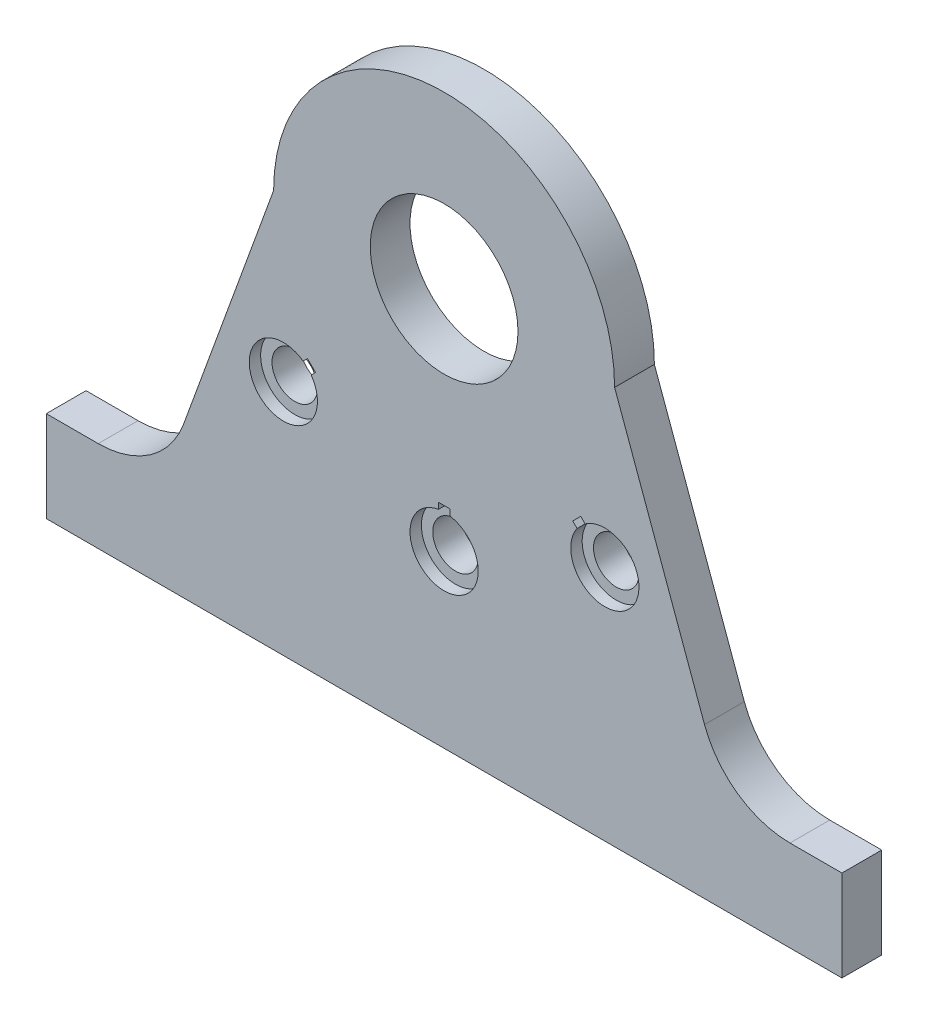
ISO-10303-21;
HEADER;
FILE_DESCRIPTION(('STEP AP214'),'2;1');
FILE_NAME('part.step','',(''),(''),'','','');
FILE_SCHEMA(('AUTOMOTIVE_DESIGN { 1 0 10303 214 1 1 1 1 }'));
ENDSEC;
DATA;
#1=APPLICATION_CONTEXT('core data for automotive mechanical design processes');
#2=APPLICATION_PROTOCOL_DEFINITION('international standard','automotive_design',2000,#1);
#3=PRODUCT_CONTEXT('',#1,'mechanical');
#4=PRODUCT('Part','Part','',(#3));
#5=PRODUCT_RELATED_PRODUCT_CATEGORY('part','',(#4));
#6=PRODUCT_DEFINITION_FORMATION('','',#4);
#7=PRODUCT_DEFINITION_CONTEXT('part definition',#1,'design');
#8=PRODUCT_DEFINITION('design','',#6,#7);
#9=PRODUCT_DEFINITION_SHAPE('','',#8);
#10=(LENGTH_UNIT() NAMED_UNIT(*) SI_UNIT(.MILLI.,.METRE.));
#11=(NAMED_UNIT(*) PLANE_ANGLE_UNIT() SI_UNIT($,.RADIAN.));
#12=(NAMED_UNIT(*) SI_UNIT($,.STERADIAN.) SOLID_ANGLE_UNIT());
#13=UNCERTAINTY_MEASURE_WITH_UNIT(LENGTH_MEASURE(1.E-05),#10,'distance_accuracy_value','');
#14=(GEOMETRIC_REPRESENTATION_CONTEXT(3) GLOBAL_UNCERTAINTY_ASSIGNED_CONTEXT((#13)) GLOBAL_UNIT_ASSIGNED_CONTEXT((#10,
#11,#12)) REPRESENTATION_CONTEXT('',''));
#15=CARTESIAN_POINT('',(0.,0.,0.));
#16=DIRECTION('',(0.,0.,1.));
#17=DIRECTION('',(1.,0.,0.));
#18=AXIS2_PLACEMENT_3D('',#15,#16,#17);
#19=CARTESIAN_POINT('',(14.142135623731,-14.142135623731,-6.5));
#20=DIRECTION('',(0.,0.,1.));
#21=DIRECTION('',(1.,0.,0.));
#22=AXIS2_PLACEMENT_3D('',#19,#20,#21);
#23=CYLINDRICAL_SURFACE('',#22,2.);
#24=CARTESIAN_POINT('',(14.142135623731,-14.142135623731,0.));
#25=DIRECTION('',(0.,0.,1.));
#26=DIRECTION('',(1.,0.,0.));
#27=AXIS2_PLACEMENT_3D('',#24,#25,#26);
#28=CIRCLE('',#27,2.);
#29=CARTESIAN_POINT('',(16.142135623731,-14.142135623731,0.));
#30=VERTEX_POINT('',#29);
#31=EDGE_CURVE('E440',#30,#30,#28,.T.);
#32=ORIENTED_EDGE('',*,*,#31,.F.);
#33=EDGE_LOOP('',(#32));
#34=FACE_BOUND('',#33,.T.);
#35=CARTESIAN_POINT('',(14.142135623731,-14.142135623731,2.5));
#36=DIRECTION('',(0.,0.,1.));
#37=DIRECTION('',(1.,0.,0.));
#38=AXIS2_PLACEMENT_3D('',#35,#36,#37);
#39=CIRCLE('',#38,2.);
#40=CARTESIAN_POINT('',(16.142135623731,-14.142135623731,2.5));
#41=VERTEX_POINT('',#40);
#42=EDGE_CURVE('E48',#41,#41,#39,.F.);
#43=ORIENTED_EDGE('',*,*,#42,.F.);
#44=EDGE_LOOP('',(#43));
#45=FACE_BOUND('',#44,.T.);
#46=ADVANCED_FACE('F44',(#34,#45),#23,.F.);
#47=CARTESIAN_POINT('',(0.,-20.,-6.5));
#48=DIRECTION('',(0.,0.,1.));
#49=DIRECTION('',(1.,0.,0.));
#50=AXIS2_PLACEMENT_3D('',#47,#48,#49);
#51=CYLINDRICAL_SURFACE('',#50,2.);
#52=CARTESIAN_POINT('',(0.,-20.,0.));
#53=DIRECTION('',(0.,0.,1.));
#54=DIRECTION('',(1.,0.,0.));
#55=AXIS2_PLACEMENT_3D('',#52,#53,#54);
#56=CIRCLE('',#55,2.);
#57=CARTESIAN_POINT('',(2.,-20.,0.));
#58=VERTEX_POINT('',#57);
#59=EDGE_CURVE('E444',#58,#58,#56,.T.);
#60=ORIENTED_EDGE('',*,*,#59,.F.);
#61=EDGE_LOOP('',(#60));
#62=FACE_BOUND('',#61,.T.);
#63=CARTESIAN_POINT('',(0.,-20.,2.5));
#64=DIRECTION('',(0.,0.,1.));
#65=DIRECTION('',(1.,0.,0.));
#66=AXIS2_PLACEMENT_3D('',#63,#64,#65);
#67=CIRCLE('',#66,2.);
#68=CARTESIAN_POINT('',(2.,-20.,2.5));
#69=VERTEX_POINT('',#68);
#70=EDGE_CURVE('E453',#69,#69,#67,.F.);
#71=ORIENTED_EDGE('',*,*,#70,.F.);
#72=EDGE_LOOP('',(#71));
#73=FACE_BOUND('',#72,.T.);
#74=ADVANCED_FACE('F463',(#62,#73),#51,.F.);
#75=CARTESIAN_POINT('',(-14.1421356237309,-14.142135623731,-6.5));
#76=DIRECTION('',(0.,0.,1.));
#77=DIRECTION('',(1.,0.,0.));
#78=AXIS2_PLACEMENT_3D('',#75,#76,#77);
#79=CYLINDRICAL_SURFACE('',#78,2.);
#80=CARTESIAN_POINT('',(-14.1421356237309,-14.142135623731,0.));
#81=DIRECTION('',(0.,0.,1.));
#82=DIRECTION('',(1.,0.,0.));
#83=AXIS2_PLACEMENT_3D('',#80,#81,#82);
#84=CIRCLE('',#83,2.);
#85=CARTESIAN_POINT('',(-12.1421356237309,-14.142135623731,0.));
#86=VERTEX_POINT('',#85);
#87=EDGE_CURVE('E343',#86,#86,#84,.T.);
#88=ORIENTED_EDGE('',*,*,#87,.F.);
#89=EDGE_LOOP('',(#88));
#90=FACE_BOUND('',#89,.T.);
#91=CARTESIAN_POINT('',(-14.1421356237309,-14.142135623731,2.5));
#92=DIRECTION('',(0.,0.,1.));
#93=DIRECTION('',(1.,0.,0.));
#94=AXIS2_PLACEMENT_3D('',#91,#92,#93);
#95=CIRCLE('',#94,2.);
#96=CARTESIAN_POINT('',(-12.1421356237309,-14.142135623731,2.5));
#97=VERTEX_POINT('',#96);
#98=EDGE_CURVE('E243',#97,#97,#95,.F.);
#99=ORIENTED_EDGE('',*,*,#98,.F.);
#100=EDGE_LOOP('',(#99));
#101=FACE_BOUND('',#100,.T.);
#102=ADVANCED_FACE('F470',(#90,#101),#79,.F.);
#103=CARTESIAN_POINT('',(0.,0.,3.5));
#104=DIRECTION('',(0.,0.,1.));
#105=DIRECTION('',(1.,0.,0.));
#106=AXIS2_PLACEMENT_3D('',#103,#104,#105);
#107=PLANE('',#106);
#108=DIRECTION('',(-0.707106781186547,-0.707106781186548,0.));
#109=VECTOR('',#108,1.);
#110=CARTESIAN_POINT('',(11.6672618895781,-11.667261889578,3.5));
#111=LINE('',#110,#109);
#112=CARTESIAN_POINT('',(12.0208152801713,-11.3137084989848,3.5));
#113=VERTEX_POINT('',#112);
#114=CARTESIAN_POINT('',(11.3137084989848,-12.0208152801713,3.5));
#115=VERTEX_POINT('',#114);
#116=EDGE_CURVE('E62',#113,#115,#111,.T.);
#117=ORIENTED_EDGE('',*,*,#116,.F.);
#118=DIRECTION('',(-0.707106781186538,0.707106781186557,0.));
#119=VECTOR('',#118,1.);
#120=CARTESIAN_POINT('',(0.353553390593446,0.353553390593436,3.5));
#121=LINE('',#120,#119);
#122=CARTESIAN_POINT('',(12.404038947989,-11.6969321668025,3.5));
#123=VERTEX_POINT('',#122);
#124=EDGE_CURVE('E220',#123,#113,#121,.T.);
#125=ORIENTED_EDGE('',*,*,#124,.F.);
#126=CARTESIAN_POINT('',(14.142135623731,-14.142135623731,3.5));
#127=DIRECTION('',(0.,0.,1.));
#128=DIRECTION('',(1.,0.,0.));
#129=AXIS2_PLACEMENT_3D('',#126,#127,#128);
#130=CIRCLE('',#129,3.);
#131=CARTESIAN_POINT('',(11.6969321668025,-12.404038947989,3.5));
#132=VERTEX_POINT('',#131);
#133=EDGE_CURVE('E224',#132,#123,#130,.T.);
#134=ORIENTED_EDGE('',*,*,#133,.F.);
#135=DIRECTION('',(0.707106781186541,-0.707106781186554,0.));
#136=VECTOR('',#135,1.);
#137=CARTESIAN_POINT('',(-0.353553390593173,-0.353553390593167,3.5));
#138=LINE('',#137,#136);
#139=EDGE_CURVE('E233',#115,#132,#138,.T.);
#140=ORIENTED_EDGE('',*,*,#139,.F.);
#141=EDGE_LOOP('',(#117,#125,#134,#140));
#142=FACE_BOUND('',#141,.T.);
#143=DIRECTION('',(-1.,0.,0.));
#144=VECTOR('',#143,1.);
#145=CARTESIAN_POINT('',(0.,-16.5,3.5));
#146=LINE('',#145,#144);
#147=CARTESIAN_POINT('',(0.5,-16.5,3.5));
#148=VERTEX_POINT('',#147);
#149=CARTESIAN_POINT('',(-0.5,-16.5,3.5));
#150=VERTEX_POINT('',#149);
#151=EDGE_CURVE('E70',#148,#150,#146,.T.);
#152=ORIENTED_EDGE('',*,*,#151,.F.);
#153=DIRECTION('',(0.,1.,0.));
#154=VECTOR('',#153,1.);
#155=CARTESIAN_POINT('',(0.500000000000003,0.,3.5));
#156=LINE('',#155,#154);
#157=CARTESIAN_POINT('',(0.5,-17.0419601084502,3.5));
#158=VERTEX_POINT('',#157);
#159=EDGE_CURVE('E254',#158,#148,#156,.T.);
#160=ORIENTED_EDGE('',*,*,#159,.F.);
#161=CARTESIAN_POINT('',(0.,-20.,3.5));
#162=DIRECTION('',(0.,0.,1.));
#163=DIRECTION('',(1.,0.,0.));
#164=AXIS2_PLACEMENT_3D('',#161,#162,#163);
#165=CIRCLE('',#164,3.);
#166=CARTESIAN_POINT('',(-0.5,-17.0419601084502,3.5));
#167=VERTEX_POINT('',#166);
#168=EDGE_CURVE('E274',#167,#158,#165,.T.);
#169=ORIENTED_EDGE('',*,*,#168,.F.);
#170=DIRECTION('',(0.,-1.,0.));
#171=VECTOR('',#170,1.);
#172=CARTESIAN_POINT('',(-0.5,0.,3.5));
#173=LINE('',#172,#171);
#174=EDGE_CURVE('E269',#150,#167,#173,.T.);
#175=ORIENTED_EDGE('',*,*,#174,.F.);
#176=EDGE_LOOP('',(#152,#160,#169,#175));
#177=FACE_BOUND('',#176,.T.);
#178=DIRECTION('',(-0.707106781186548,0.707106781186547,0.));
#179=VECTOR('',#178,1.);
#180=CARTESIAN_POINT('',(-11.667261889578,-11.6672618895781,3.5));
#181=LINE('',#180,#179);
#182=CARTESIAN_POINT('',(-11.3137084989848,-12.0208152801713,3.5));
#183=VERTEX_POINT('',#182);
#184=CARTESIAN_POINT('',(-12.0208152801713,-11.3137084989848,3.5));
#185=VERTEX_POINT('',#184);
#186=EDGE_CURVE('E309',#183,#185,#181,.T.);
#187=ORIENTED_EDGE('',*,*,#186,.F.);
#188=DIRECTION('',(0.707106781186551,0.707106781186544,0.));
#189=VECTOR('',#188,1.);
#190=CARTESIAN_POINT('',(0.353553390593328,-0.353553390593331,3.5));
#191=LINE('',#190,#189);
#192=CARTESIAN_POINT('',(-11.6969321668025,-12.404038947989,3.5));
#193=VERTEX_POINT('',#192);
#194=EDGE_CURVE('E296',#193,#183,#191,.T.);
#195=ORIENTED_EDGE('',*,*,#194,.F.);
#196=CARTESIAN_POINT('',(-14.142135623731,-14.142135623731,3.5));
#197=DIRECTION('',(0.,0.,1.));
#198=DIRECTION('',(1.,0.,0.));
#199=AXIS2_PLACEMENT_3D('',#196,#197,#198);
#200=CIRCLE('',#199,3.00000000000001);
#201=CARTESIAN_POINT('',(-12.404038947989,-11.6969321668025,3.5));
#202=VERTEX_POINT('',#201);
#203=EDGE_CURVE('E316',#202,#193,#200,.T.);
#204=ORIENTED_EDGE('',*,*,#203,.F.);
#205=DIRECTION('',(-0.70710678118656,-0.707106781186535,0.));
#206=VECTOR('',#205,1.);
#207=CARTESIAN_POINT('',(-0.353553390593052,0.353553390593065,3.5));
#208=LINE('',#207,#206);
#209=EDGE_CURVE('E312',#185,#202,#208,.T.);
#210=ORIENTED_EDGE('',*,*,#209,.F.);
#211=EDGE_LOOP('',(#187,#195,#204,#210));
#212=FACE_BOUND('',#211,.T.);
#213=CARTESIAN_POINT('',(0.,0.,3.5));
#214=DIRECTION('',(0.,0.,1.));
#215=DIRECTION('',(1.,0.,0.));
#216=AXIS2_PLACEMENT_3D('',#213,#214,#215);
#217=CIRCLE('',#216,15.);
#218=CARTESIAN_POINT('',(15.,0.,3.5));
#219=VERTEX_POINT('',#218);
#220=CARTESIAN_POINT('',(-15.,0.,3.5));
#221=VERTEX_POINT('',#220);
#222=EDGE_CURVE('E344',#219,#221,#217,.T.);
#223=ORIENTED_EDGE('',*,*,#222,.T.);
#224=DIRECTION('',(-0.342020143325669,-0.939692620785908,0.));
#225=VECTOR('',#224,1.);
#226=CARTESIAN_POINT('',(-15.,0.,3.5));
#227=LINE('',#226,#225);
#228=CARTESIAN_POINT('',(-22.9113156645779,-21.7361611466054,3.5));
#229=VERTEX_POINT('',#228);
#230=EDGE_CURVE('E348',#221,#229,#227,.T.);
#231=ORIENTED_EDGE('',*,*,#230,.T.);
#232=CARTESIAN_POINT('',(-30.4288566308652,-19.,3.5));
#233=DIRECTION('',(0.,0.,-1.));
#234=DIRECTION('',(1.,0.,0.));
#235=AXIS2_PLACEMENT_3D('',#232,#233,#234);
#236=CIRCLE('',#235,8.);
#237=CARTESIAN_POINT('',(-30.4288566308652,-27.,3.5));
#238=VERTEX_POINT('',#237);
#239=EDGE_CURVE('E352',#229,#238,#236,.T.);
#240=ORIENTED_EDGE('',*,*,#239,.T.);
#241=DIRECTION('',(-1.,0.,0.));
#242=VECTOR('',#241,1.);
#243=CARTESIAN_POINT('',(-30.4288566308652,-27.,3.5));
#244=LINE('',#243,#242);
#245=CARTESIAN_POINT('',(-35.,-27.,3.5));
#246=VERTEX_POINT('',#245);
#247=EDGE_CURVE('E355',#238,#246,#244,.T.);
#248=ORIENTED_EDGE('',*,*,#247,.T.);
#249=DIRECTION('',(0.,-1.,0.));
#250=VECTOR('',#249,1.);
#251=CARTESIAN_POINT('',(-35.,-27.,3.5));
#252=LINE('',#251,#250);
#253=CARTESIAN_POINT('',(-35.,-35.,3.5));
#254=VERTEX_POINT('',#253);
#255=EDGE_CURVE('E358',#246,#254,#252,.T.);
#256=ORIENTED_EDGE('',*,*,#255,.T.);
#257=DIRECTION('',(1.,0.,0.));
#258=VECTOR('',#257,1.);
#259=CARTESIAN_POINT('',(-35.,-35.,3.5));
#260=LINE('',#259,#258);
#261=CARTESIAN_POINT('',(35.,-35.,3.5));
#262=VERTEX_POINT('',#261);
#263=EDGE_CURVE('E361',#254,#262,#260,.T.);
#264=ORIENTED_EDGE('',*,*,#263,.T.);
#265=DIRECTION('',(0.,1.,0.));
#266=VECTOR('',#265,1.);
#267=CARTESIAN_POINT('',(35.,-35.,3.5));
#268=LINE('',#267,#266);
#269=CARTESIAN_POINT('',(35.,-27.,3.5));
#270=VERTEX_POINT('',#269);
#271=EDGE_CURVE('E364',#262,#270,#268,.T.);
#272=ORIENTED_EDGE('',*,*,#271,.T.);
#273=DIRECTION('',(-1.,0.,0.));
#274=VECTOR('',#273,1.);
#275=CARTESIAN_POINT('',(35.,-27.,3.5));
#276=LINE('',#275,#274);
#277=CARTESIAN_POINT('',(30.4288566308652,-27.,3.5));
#278=VERTEX_POINT('',#277);
#279=EDGE_CURVE('E367',#270,#278,#276,.T.);
#280=ORIENTED_EDGE('',*,*,#279,.T.);
#281=CARTESIAN_POINT('',(30.4288566308652,-19.,3.5));
#282=DIRECTION('',(0.,0.,-1.));
#283=DIRECTION('',(-1.,0.,0.));
#284=AXIS2_PLACEMENT_3D('',#281,#282,#283);
#285=CIRCLE('',#284,8.);
#286=CARTESIAN_POINT('',(22.9113156645779,-21.7361611466054,3.5));
#287=VERTEX_POINT('',#286);
#288=EDGE_CURVE('E370',#278,#287,#285,.T.);
#289=ORIENTED_EDGE('',*,*,#288,.T.);
#290=DIRECTION('',(-0.342020143325669,0.939692620785908,0.));
#291=VECTOR('',#290,1.);
#292=CARTESIAN_POINT('',(22.9113156645779,-21.7361611466054,3.5));
#293=LINE('',#292,#291);
#294=EDGE_CURVE('E373',#287,#219,#293,.T.);
#295=ORIENTED_EDGE('',*,*,#294,.T.);
#296=EDGE_LOOP('',(#223,#231,#240,#248,#256,#264,#272,#280,#289,#295));
#297=FACE_BOUND('',#296,.T.);
#298=CARTESIAN_POINT('',(0.,0.,3.5));
#299=DIRECTION('',(0.,0.,1.));
#300=DIRECTION('',(1.,0.,0.));
#301=AXIS2_PLACEMENT_3D('',#298,#299,#300);
#302=CIRCLE('',#301,6.5);
#303=CARTESIAN_POINT('',(6.5,0.,3.5));
#304=VERTEX_POINT('',#303);
#305=EDGE_CURVE('E334',#304,#304,#302,.T.);
#306=ORIENTED_EDGE('',*,*,#305,.F.);
#307=EDGE_LOOP('',(#306));
#308=FACE_BOUND('',#307,.T.);
#309=ADVANCED_FACE('F482',(#142,#177,#212,#297,#308),#107,.T.);
#310=CARTESIAN_POINT('',(0.,0.,0.));
#311=DIRECTION('',(0.,0.,1.));
#312=DIRECTION('',(1.,0.,0.));
#313=AXIS2_PLACEMENT_3D('',#310,#311,#312);
#314=PLANE('',#313);
#315=ORIENTED_EDGE('',*,*,#87,.T.);
#316=EDGE_LOOP('',(#315));
#317=FACE_BOUND('',#316,.T.);
#318=ORIENTED_EDGE('',*,*,#59,.T.);
#319=EDGE_LOOP('',(#318));
#320=FACE_BOUND('',#319,.T.);
#321=ORIENTED_EDGE('',*,*,#31,.T.);
#322=EDGE_LOOP('',(#321));
#323=FACE_BOUND('',#322,.T.);
#324=CARTESIAN_POINT('',(0.,0.,0.));
#325=DIRECTION('',(0.,0.,1.));
#326=DIRECTION('',(1.,0.,0.));
#327=AXIS2_PLACEMENT_3D('',#324,#325,#326);
#328=CIRCLE('',#327,15.);
#329=CARTESIAN_POINT('',(15.,0.,0.));
#330=VERTEX_POINT('',#329);
#331=CARTESIAN_POINT('',(-15.,0.,0.));
#332=VERTEX_POINT('',#331);
#333=EDGE_CURVE('E338',#330,#332,#328,.T.);
#334=ORIENTED_EDGE('',*,*,#333,.F.);
#335=DIRECTION('',(-0.342020143325669,0.939692620785908,0.));
#336=VECTOR('',#335,1.);
#337=CARTESIAN_POINT('',(22.9113156645779,-21.7361611466054,0.));
#338=LINE('',#337,#336);
#339=CARTESIAN_POINT('',(22.9113156645779,-21.7361611466054,0.));
#340=VERTEX_POINT('',#339);
#341=EDGE_CURVE('E349',#340,#330,#338,.T.);
#342=ORIENTED_EDGE('',*,*,#341,.F.);
#343=CARTESIAN_POINT('',(30.4288566308652,-19.,0.));
#344=DIRECTION('',(0.,0.,-1.));
#345=DIRECTION('',(-1.,0.,0.));
#346=AXIS2_PLACEMENT_3D('',#343,#344,#345);
#347=CIRCLE('',#346,8.);
#348=CARTESIAN_POINT('',(30.4288566308652,-27.,0.));
#349=VERTEX_POINT('',#348);
#350=EDGE_CURVE('E401',#349,#340,#347,.T.);
#351=ORIENTED_EDGE('',*,*,#350,.F.);
#352=DIRECTION('',(-1.,0.,0.));
#353=VECTOR('',#352,1.);
#354=CARTESIAN_POINT('',(35.,-27.,0.));
#355=LINE('',#354,#353);
#356=CARTESIAN_POINT('',(35.,-27.,0.));
#357=VERTEX_POINT('',#356);
#358=EDGE_CURVE('E398',#357,#349,#355,.T.);
#359=ORIENTED_EDGE('',*,*,#358,.F.);
#360=DIRECTION('',(0.,1.,0.));
#361=VECTOR('',#360,1.);
#362=CARTESIAN_POINT('',(35.,-35.,0.));
#363=LINE('',#362,#361);
#364=CARTESIAN_POINT('',(35.,-35.,0.));
#365=VERTEX_POINT('',#364);
#366=EDGE_CURVE('E395',#365,#357,#363,.T.);
#367=ORIENTED_EDGE('',*,*,#366,.F.);
#368=DIRECTION('',(1.,0.,0.));
#369=VECTOR('',#368,1.);
#370=CARTESIAN_POINT('',(-35.,-35.,0.));
#371=LINE('',#370,#369);
#372=CARTESIAN_POINT('',(-35.,-35.,0.));
#373=VERTEX_POINT('',#372);
#374=EDGE_CURVE('E392',#373,#365,#371,.T.);
#375=ORIENTED_EDGE('',*,*,#374,.F.);
#376=DIRECTION('',(0.,-1.,0.));
#377=VECTOR('',#376,1.);
#378=CARTESIAN_POINT('',(-35.,-27.,0.));
#379=LINE('',#378,#377);
#380=CARTESIAN_POINT('',(-35.,-27.,0.));
#381=VERTEX_POINT('',#380);
#382=EDGE_CURVE('E389',#381,#373,#379,.T.);
#383=ORIENTED_EDGE('',*,*,#382,.F.);
#384=DIRECTION('',(-1.,0.,0.));
#385=VECTOR('',#384,1.);
#386=CARTESIAN_POINT('',(-30.4288566308652,-27.,0.));
#387=LINE('',#386,#385);
#388=CARTESIAN_POINT('',(-30.4288566308652,-27.,0.));
#389=VERTEX_POINT('',#388);
#390=EDGE_CURVE('E386',#389,#381,#387,.T.);
#391=ORIENTED_EDGE('',*,*,#390,.F.);
#392=CARTESIAN_POINT('',(-30.4288566308652,-19.,0.));
#393=DIRECTION('',(0.,0.,-1.));
#394=DIRECTION('',(1.,0.,0.));
#395=AXIS2_PLACEMENT_3D('',#392,#393,#394);
#396=CIRCLE('',#395,8.);
#397=CARTESIAN_POINT('',(-22.9113156645779,-21.7361611466054,0.));
#398=VERTEX_POINT('',#397);
#399=EDGE_CURVE('E383',#398,#389,#396,.T.);
#400=ORIENTED_EDGE('',*,*,#399,.F.);
#401=DIRECTION('',(-0.342020143325669,-0.939692620785908,0.));
#402=VECTOR('',#401,1.);
#403=CARTESIAN_POINT('',(-15.,0.,0.));
#404=LINE('',#403,#402);
#405=EDGE_CURVE('E380',#332,#398,#404,.T.);
#406=ORIENTED_EDGE('',*,*,#405,.F.);
#407=EDGE_LOOP('',(#334,#342,#351,#359,#367,#375,#383,#391,#400,#406));
#408=FACE_BOUND('',#407,.T.);
#409=CARTESIAN_POINT('',(0.,0.,0.));
#410=DIRECTION('',(0.,0.,1.));
#411=DIRECTION('',(1.,0.,0.));
#412=AXIS2_PLACEMENT_3D('',#409,#410,#411);
#413=CIRCLE('',#412,6.5);
#414=CARTESIAN_POINT('',(6.5,0.,0.));
#415=VERTEX_POINT('',#414);
#416=EDGE_CURVE('E339',#415,#415,#413,.T.);
#417=ORIENTED_EDGE('',*,*,#416,.T.);
#418=EDGE_LOOP('',(#417));
#419=FACE_BOUND('',#418,.T.);
#420=ADVANCED_FACE('F485',(#317,#320,#323,#408,#419),#314,.F.);
#421=CARTESIAN_POINT('',(0.,0.,3.5));
#422=DIRECTION('',(0.,0.,-1.));
#423=DIRECTION('',(-1.,0.,0.));
#424=AXIS2_PLACEMENT_3D('',#421,#422,#423);
#425=CYLINDRICAL_SURFACE('',#424,15.);
#426=ORIENTED_EDGE('',*,*,#333,.T.);
#427=DIRECTION('',(0.,0.,-1.));
#428=VECTOR('',#427,1.);
#429=CARTESIAN_POINT('',(-15.,0.,3.5));
#430=LINE('',#429,#428);
#431=EDGE_CURVE('E11',#221,#332,#430,.T.);
#432=ORIENTED_EDGE('',*,*,#431,.F.);
#433=ORIENTED_EDGE('',*,*,#222,.F.);
#434=DIRECTION('',(0.,0.,-1.));
#435=VECTOR('',#434,1.);
#436=CARTESIAN_POINT('',(15.,0.,3.5));
#437=LINE('',#436,#435);
#438=EDGE_CURVE('E376',#219,#330,#437,.T.);
#439=ORIENTED_EDGE('',*,*,#438,.T.);
#440=EDGE_LOOP('',(#426,#432,#433,#439));
#441=FACE_BOUND('',#440,.T.);
#442=ADVANCED_FACE('F46',(#441),#425,.T.);
#443=CARTESIAN_POINT('',(-15.,0.,3.5));
#444=DIRECTION('',(0.939692620785908,-0.342020143325669,0.));
#445=DIRECTION('',(0.342020143325669,0.939692620785908,0.));
#446=AXIS2_PLACEMENT_3D('',#443,#444,#445);
#447=PLANE('',#446);
#448=ORIENTED_EDGE('',*,*,#405,.T.);
#449=DIRECTION('',(0.,0.,-1.));
#450=VECTOR('',#449,1.);
#451=CARTESIAN_POINT('',(-22.9113156645779,-21.7361611466054,3.5));
#452=LINE('',#451,#450);
#453=EDGE_CURVE('E54',#229,#398,#452,.T.);
#454=ORIENTED_EDGE('',*,*,#453,.F.);
#455=ORIENTED_EDGE('',*,*,#230,.F.);
#456=ORIENTED_EDGE('',*,*,#431,.T.);
#457=EDGE_LOOP('',(#448,#454,#455,#456));
#458=FACE_BOUND('',#457,.T.);
#459=ADVANCED_FACE('F518',(#458),#447,.F.);
#460=CARTESIAN_POINT('',(-30.4288566308652,-19.,3.5));
#461=DIRECTION('',(0.,0.,-1.));
#462=DIRECTION('',(-1.,0.,0.));
#463=AXIS2_PLACEMENT_3D('',#460,#461,#462);
#464=CYLINDRICAL_SURFACE('',#463,8.);
#465=ORIENTED_EDGE('',*,*,#399,.T.);
#466=DIRECTION('',(0.,0.,-1.));
#467=VECTOR('',#466,1.);
#468=CARTESIAN_POINT('',(-30.4288566308652,-27.,3.5));
#469=LINE('',#468,#467);
#470=EDGE_CURVE('E433',#238,#389,#469,.T.);
#471=ORIENTED_EDGE('',*,*,#470,.F.);
#472=ORIENTED_EDGE('',*,*,#239,.F.);
#473=ORIENTED_EDGE('',*,*,#453,.T.);
#474=EDGE_LOOP('',(#465,#471,#472,#473));
#475=FACE_BOUND('',#474,.T.);
#476=ADVANCED_FACE('F515',(#475),#464,.F.);
#477=CARTESIAN_POINT('',(-30.4288566308652,-27.,3.5));
#478=DIRECTION('',(0.,-1.,0.));
#479=DIRECTION('',(0.,0.,-1.));
#480=AXIS2_PLACEMENT_3D('',#477,#478,#479);
#481=PLANE('',#480);
#482=ORIENTED_EDGE('',*,*,#390,.T.);
#483=DIRECTION('',(0.,0.,-1.));
#484=VECTOR('',#483,1.);
#485=CARTESIAN_POINT('',(-35.,-27.,3.5));
#486=LINE('',#485,#484);
#487=EDGE_CURVE('E429',#246,#381,#486,.T.);
#488=ORIENTED_EDGE('',*,*,#487,.F.);
#489=ORIENTED_EDGE('',*,*,#247,.F.);
#490=ORIENTED_EDGE('',*,*,#470,.T.);
#491=EDGE_LOOP('',(#482,#488,#489,#490));
#492=FACE_BOUND('',#491,.T.);
#493=ADVANCED_FACE('F511',(#492),#481,.F.);
#494=CARTESIAN_POINT('',(-35.,-27.,3.5));
#495=DIRECTION('',(1.,0.,0.));
#496=DIRECTION('',(0.,1.,0.));
#497=AXIS2_PLACEMENT_3D('',#494,#495,#496);
#498=PLANE('',#497);
#499=ORIENTED_EDGE('',*,*,#382,.T.);
#500=DIRECTION('',(0.,0.,-1.));
#501=VECTOR('',#500,1.);
#502=CARTESIAN_POINT('',(-35.,-35.,3.5));
#503=LINE('',#502,#501);
#504=EDGE_CURVE('E425',#254,#373,#503,.T.);
#505=ORIENTED_EDGE('',*,*,#504,.F.);
#506=ORIENTED_EDGE('',*,*,#255,.F.);
#507=ORIENTED_EDGE('',*,*,#487,.T.);
#508=EDGE_LOOP('',(#499,#505,#506,#507));
#509=FACE_BOUND('',#508,.T.);
#510=ADVANCED_FACE('F507',(#509),#498,.F.);
#511=CARTESIAN_POINT('',(-35.,-35.,3.5));
#512=DIRECTION('',(0.,1.,0.));
#513=DIRECTION('',(0.,0.,1.));
#514=AXIS2_PLACEMENT_3D('',#511,#512,#513);
#515=PLANE('',#514);
#516=ORIENTED_EDGE('',*,*,#374,.T.);
#517=DIRECTION('',(0.,0.,-1.));
#518=VECTOR('',#517,1.);
#519=CARTESIAN_POINT('',(35.,-35.,3.5));
#520=LINE('',#519,#518);
#521=EDGE_CURVE('E421',#262,#365,#520,.T.);
#522=ORIENTED_EDGE('',*,*,#521,.F.);
#523=ORIENTED_EDGE('',*,*,#263,.F.);
#524=ORIENTED_EDGE('',*,*,#504,.T.);
#525=EDGE_LOOP('',(#516,#522,#523,#524));
#526=FACE_BOUND('',#525,.T.);
#527=ADVANCED_FACE('F503',(#526),#515,.F.);
#528=CARTESIAN_POINT('',(35.,-35.,3.5));
#529=DIRECTION('',(-1.,0.,0.));
#530=DIRECTION('',(0.,-1.,0.));
#531=AXIS2_PLACEMENT_3D('',#528,#529,#530);
#532=PLANE('',#531);
#533=ORIENTED_EDGE('',*,*,#366,.T.);
#534=DIRECTION('',(0.,0.,-1.));
#535=VECTOR('',#534,1.);
#536=CARTESIAN_POINT('',(35.,-27.,3.5));
#537=LINE('',#536,#535);
#538=EDGE_CURVE('E417',#270,#357,#537,.T.);
#539=ORIENTED_EDGE('',*,*,#538,.F.);
#540=ORIENTED_EDGE('',*,*,#271,.F.);
#541=ORIENTED_EDGE('',*,*,#521,.T.);
#542=EDGE_LOOP('',(#533,#539,#540,#541));
#543=FACE_BOUND('',#542,.T.);
#544=ADVANCED_FACE('F499',(#543),#532,.F.);
#545=CARTESIAN_POINT('',(35.,-27.,3.5));
#546=DIRECTION('',(0.,-1.,0.));
#547=DIRECTION('',(0.,0.,-1.));
#548=AXIS2_PLACEMENT_3D('',#545,#546,#547);
#549=PLANE('',#548);
#550=ORIENTED_EDGE('',*,*,#358,.T.);
#551=DIRECTION('',(0.,0.,-1.));
#552=VECTOR('',#551,1.);
#553=CARTESIAN_POINT('',(30.4288566308652,-27.,3.5));
#554=LINE('',#553,#552);
#555=EDGE_CURVE('E413',#278,#349,#554,.T.);
#556=ORIENTED_EDGE('',*,*,#555,.F.);
#557=ORIENTED_EDGE('',*,*,#279,.F.);
#558=ORIENTED_EDGE('',*,*,#538,.T.);
#559=EDGE_LOOP('',(#550,#556,#557,#558));
#560=FACE_BOUND('',#559,.T.);
#561=ADVANCED_FACE('F495',(#560),#549,.F.);
#562=CARTESIAN_POINT('',(30.4288566308652,-19.,3.5));
#563=DIRECTION('',(0.,0.,-1.));
#564=DIRECTION('',(-1.,0.,0.));
#565=AXIS2_PLACEMENT_3D('',#562,#563,#564);
#566=CYLINDRICAL_SURFACE('',#565,8.);
#567=ORIENTED_EDGE('',*,*,#350,.T.);
#568=DIRECTION('',(0.,0.,-1.));
#569=VECTOR('',#568,1.);
#570=CARTESIAN_POINT('',(22.9113156645779,-21.7361611466054,3.5));
#571=LINE('',#570,#569);
#572=EDGE_CURVE('E409',#287,#340,#571,.T.);
#573=ORIENTED_EDGE('',*,*,#572,.F.);
#574=ORIENTED_EDGE('',*,*,#288,.F.);
#575=ORIENTED_EDGE('',*,*,#555,.T.);
#576=EDGE_LOOP('',(#567,#573,#574,#575));
#577=FACE_BOUND('',#576,.T.);
#578=ADVANCED_FACE('F491',(#577),#566,.F.);
#579=CARTESIAN_POINT('',(22.9113156645779,-21.7361611466054,3.5));
#580=DIRECTION('',(-0.939692620785908,-0.342020143325669,0.));
#581=DIRECTION('',(0.34202014332567,-0.939692620785908,0.));
#582=AXIS2_PLACEMENT_3D('',#579,#580,#581);
#583=PLANE('',#582);
#584=ORIENTED_EDGE('',*,*,#341,.T.);
#585=ORIENTED_EDGE('',*,*,#438,.F.);
#586=ORIENTED_EDGE('',*,*,#294,.F.);
#587=ORIENTED_EDGE('',*,*,#572,.T.);
#588=EDGE_LOOP('',(#584,#585,#586,#587));
#589=FACE_BOUND('',#588,.T.);
#590=ADVANCED_FACE('F480',(#589),#583,.F.);
#591=CARTESIAN_POINT('',(0.,0.,3.5));
#592=DIRECTION('',(0.,0.,-1.));
#593=DIRECTION('',(-1.,0.,0.));
#594=AXIS2_PLACEMENT_3D('',#591,#592,#593);
#595=CYLINDRICAL_SURFACE('',#594,6.5);
#596=ORIENTED_EDGE('',*,*,#305,.T.);
#597=EDGE_LOOP('',(#596));
#598=FACE_BOUND('',#597,.T.);
#599=ORIENTED_EDGE('',*,*,#416,.F.);
#600=EDGE_LOOP('',(#599));
#601=FACE_BOUND('',#600,.T.);
#602=ADVANCED_FACE('F476',(#598,#601),#595,.F.);
#603=CARTESIAN_POINT('',(-14.142135623731,-14.142135623731,2.5));
#604=DIRECTION('',(0.,0.,1.));
#605=DIRECTION('',(1.,0.,0.));
#606=AXIS2_PLACEMENT_3D('',#603,#604,#605);
#607=PLANE('',#606);
#608=DIRECTION('',(-0.707106781186548,0.707106781186547,0.));
#609=VECTOR('',#608,1.);
#610=CARTESIAN_POINT('',(-11.667261889578,-11.6672618895781,2.5));
#611=LINE('',#610,#609);
#612=CARTESIAN_POINT('',(-11.3137084989848,-12.0208152801713,2.5));
#613=VERTEX_POINT('',#612);
#614=CARTESIAN_POINT('',(-12.0208152801713,-11.3137084989848,2.5));
#615=VERTEX_POINT('',#614);
#616=EDGE_CURVE('E291',#613,#615,#611,.T.);
#617=ORIENTED_EDGE('',*,*,#616,.T.);
#618=DIRECTION('',(-0.70710678118656,-0.707106781186535,0.));
#619=VECTOR('',#618,1.);
#620=CARTESIAN_POINT('',(-0.353553390593052,0.353553390593065,2.5));
#621=LINE('',#620,#619);
#622=CARTESIAN_POINT('',(-12.404038947989,-11.6969321668025,2.5));
#623=VERTEX_POINT('',#622);
#624=EDGE_CURVE('E295',#615,#623,#621,.T.);
#625=ORIENTED_EDGE('',*,*,#624,.T.);
#626=CARTESIAN_POINT('',(-14.142135623731,-14.142135623731,2.5));
#627=DIRECTION('',(0.,0.,1.));
#628=DIRECTION('',(1.,0.,0.));
#629=AXIS2_PLACEMENT_3D('',#626,#627,#628);
#630=CIRCLE('',#629,3.00000000000001);
#631=CARTESIAN_POINT('',(-11.6969321668025,-12.404038947989,2.5));
#632=VERTEX_POINT('',#631);
#633=EDGE_CURVE('E300',#623,#632,#630,.T.);
#634=ORIENTED_EDGE('',*,*,#633,.T.);
#635=DIRECTION('',(0.707106781186551,0.707106781186544,0.));
#636=VECTOR('',#635,1.);
#637=CARTESIAN_POINT('',(0.353553390593328,-0.353553390593331,2.5));
#638=LINE('',#637,#636);
#639=EDGE_CURVE('E304',#632,#613,#638,.T.);
#640=ORIENTED_EDGE('',*,*,#639,.T.);
#641=EDGE_LOOP('',(#617,#625,#634,#640));
#642=FACE_BOUND('',#641,.T.);
#643=ORIENTED_EDGE('',*,*,#98,.T.);
#644=EDGE_LOOP('',(#643));
#645=FACE_BOUND('',#644,.T.);
#646=ADVANCED_FACE('F479',(#642,#645),#607,.T.);
#647=CARTESIAN_POINT('',(-11.667261889578,-11.6672618895781,2.5));
#648=DIRECTION('',(0.707106781186547,0.707106781186548,0.));
#649=DIRECTION('',(-0.707106781186548,0.707106781186547,0.));
#650=AXIS2_PLACEMENT_3D('',#647,#648,#649);
#651=PLANE('',#650);
#652=ORIENTED_EDGE('',*,*,#186,.T.);
#653=DIRECTION('',(0.,0.,1.));
#654=VECTOR('',#653,1.);
#655=CARTESIAN_POINT('',(-12.0208152801713,-11.3137084989848,2.5));
#656=LINE('',#655,#654);
#657=EDGE_CURVE('E308',#615,#185,#656,.T.);
#658=ORIENTED_EDGE('',*,*,#657,.F.);
#659=ORIENTED_EDGE('',*,*,#616,.F.);
#660=DIRECTION('',(0.,0.,1.));
#661=VECTOR('',#660,1.);
#662=CARTESIAN_POINT('',(-11.3137084989848,-12.0208152801713,2.5));
#663=LINE('',#662,#661);
#664=EDGE_CURVE('E270',#613,#183,#663,.T.);
#665=ORIENTED_EDGE('',*,*,#664,.T.);
#666=EDGE_LOOP('',(#652,#658,#659,#665));
#667=FACE_BOUND('',#666,.T.);
#668=ADVANCED_FACE('F652',(#667),#651,.F.);
#669=CARTESIAN_POINT('',(0.353553390593328,-0.353553390593331,2.5));
#670=DIRECTION('',(0.707106781186544,-0.707106781186551,0.));
#671=DIRECTION('',(0.707106781186551,0.707106781186544,0.));
#672=AXIS2_PLACEMENT_3D('',#669,#670,#671);
#673=PLANE('',#672);
#674=ORIENTED_EDGE('',*,*,#194,.T.);
#675=ORIENTED_EDGE('',*,*,#664,.F.);
#676=ORIENTED_EDGE('',*,*,#639,.F.);
#677=DIRECTION('',(0.,0.,1.));
#678=VECTOR('',#677,1.);
#679=CARTESIAN_POINT('',(-11.6969321668025,-12.404038947989,2.5));
#680=LINE('',#679,#678);
#681=EDGE_CURVE('E325',#632,#193,#680,.T.);
#682=ORIENTED_EDGE('',*,*,#681,.T.);
#683=EDGE_LOOP('',(#674,#675,#676,#682));
#684=FACE_BOUND('',#683,.T.);
#685=ADVANCED_FACE('F662',(#684),#673,.F.);
#686=CARTESIAN_POINT('',(-14.142135623731,-14.142135623731,2.5));
#687=DIRECTION('',(0.,0.,1.));
#688=DIRECTION('',(1.,0.,0.));
#689=AXIS2_PLACEMENT_3D('',#686,#687,#688);
#690=CYLINDRICAL_SURFACE('',#689,3.00000000000001);
#691=ORIENTED_EDGE('',*,*,#203,.T.);
#692=ORIENTED_EDGE('',*,*,#681,.F.);
#693=ORIENTED_EDGE('',*,*,#633,.F.);
#694=DIRECTION('',(0.,0.,1.));
#695=VECTOR('',#694,1.);
#696=CARTESIAN_POINT('',(-12.404038947989,-11.6969321668025,2.5));
#697=LINE('',#696,#695);
#698=EDGE_CURVE('E328',#623,#202,#697,.T.);
#699=ORIENTED_EDGE('',*,*,#698,.T.);
#700=EDGE_LOOP('',(#691,#692,#693,#699));
#701=FACE_BOUND('',#700,.T.);
#702=ADVANCED_FACE('F672',(#701),#690,.F.);
#703=CARTESIAN_POINT('',(-0.353553390593052,0.353553390593065,2.5));
#704=DIRECTION('',(-0.707106781186535,0.70710678118656,0.));
#705=DIRECTION('',(-0.70710678118656,-0.707106781186535,0.));
#706=AXIS2_PLACEMENT_3D('',#703,#704,#705);
#707=PLANE('',#706);
#708=ORIENTED_EDGE('',*,*,#209,.T.);
#709=ORIENTED_EDGE('',*,*,#698,.F.);
#710=ORIENTED_EDGE('',*,*,#624,.F.);
#711=ORIENTED_EDGE('',*,*,#657,.T.);
#712=EDGE_LOOP('',(#708,#709,#710,#711));
#713=FACE_BOUND('',#712,.T.);
#714=ADVANCED_FACE('F682',(#713),#707,.F.);
#715=CARTESIAN_POINT('',(0.,-20.,2.5));
#716=DIRECTION('',(0.,0.,1.));
#717=DIRECTION('',(1.,0.,0.));
#718=AXIS2_PLACEMENT_3D('',#715,#716,#717);
#719=PLANE('',#718);
#720=DIRECTION('',(-1.,0.,0.));
#721=VECTOR('',#720,1.);
#722=CARTESIAN_POINT('',(0.,-16.5,2.5));
#723=LINE('',#722,#721);
#724=CARTESIAN_POINT('',(0.5,-16.5,2.5));
#725=VERTEX_POINT('',#724);
#726=CARTESIAN_POINT('',(-0.5,-16.5,2.5));
#727=VERTEX_POINT('',#726);
#728=EDGE_CURVE('E249',#725,#727,#723,.T.);
#729=ORIENTED_EDGE('',*,*,#728,.T.);
#730=DIRECTION('',(0.,-1.,0.));
#731=VECTOR('',#730,1.);
#732=CARTESIAN_POINT('',(-0.5,0.,2.5));
#733=LINE('',#732,#731);
#734=CARTESIAN_POINT('',(-0.5,-17.0419601084502,2.5));
#735=VERTEX_POINT('',#734);
#736=EDGE_CURVE('E253',#727,#735,#733,.T.);
#737=ORIENTED_EDGE('',*,*,#736,.T.);
#738=CARTESIAN_POINT('',(0.,-20.,2.5));
#739=DIRECTION('',(0.,0.,1.));
#740=DIRECTION('',(1.,0.,0.));
#741=AXIS2_PLACEMENT_3D('',#738,#739,#740);
#742=CIRCLE('',#741,3.);
#743=CARTESIAN_POINT('',(0.5,-17.0419601084502,2.5));
#744=VERTEX_POINT('',#743);
#745=EDGE_CURVE('E258',#735,#744,#742,.T.);
#746=ORIENTED_EDGE('',*,*,#745,.T.);
#747=DIRECTION('',(0.,1.,0.));
#748=VECTOR('',#747,1.);
#749=CARTESIAN_POINT('',(0.500000000000003,0.,2.5));
#750=LINE('',#749,#748);
#751=EDGE_CURVE('E262',#744,#725,#750,.T.);
#752=ORIENTED_EDGE('',*,*,#751,.T.);
#753=EDGE_LOOP('',(#729,#737,#746,#752));
#754=FACE_BOUND('',#753,.T.);
#755=ORIENTED_EDGE('',*,*,#70,.T.);
#756=EDGE_LOOP('',(#755));
#757=FACE_BOUND('',#756,.T.);
#758=ADVANCED_FACE('F692',(#754,#757),#719,.T.);
#759=CARTESIAN_POINT('',(0.,-16.5,2.5));
#760=DIRECTION('',(0.,1.,0.));
#761=DIRECTION('',(0.,0.,1.));
#762=AXIS2_PLACEMENT_3D('',#759,#760,#761);
#763=PLANE('',#762);
#764=ORIENTED_EDGE('',*,*,#151,.T.);
#765=DIRECTION('',(0.,0.,1.));
#766=VECTOR('',#765,1.);
#767=CARTESIAN_POINT('',(-0.5,-16.5,2.5));
#768=LINE('',#767,#766);
#769=EDGE_CURVE('E266',#727,#150,#768,.T.);
#770=ORIENTED_EDGE('',*,*,#769,.F.);
#771=ORIENTED_EDGE('',*,*,#728,.F.);
#772=DIRECTION('',(0.,0.,1.));
#773=VECTOR('',#772,1.);
#774=CARTESIAN_POINT('',(0.5,-16.5,2.5));
#775=LINE('',#774,#773);
#776=EDGE_CURVE('E234',#725,#148,#775,.T.);
#777=ORIENTED_EDGE('',*,*,#776,.T.);
#778=EDGE_LOOP('',(#764,#770,#771,#777));
#779=FACE_BOUND('',#778,.T.);
#780=ADVANCED_FACE('F702',(#779),#763,.F.);
#781=CARTESIAN_POINT('',(0.500000000000003,0.,2.5));
#782=DIRECTION('',(1.,0.,0.));
#783=DIRECTION('',(0.,1.,0.));
#784=AXIS2_PLACEMENT_3D('',#781,#782,#783);
#785=PLANE('',#784);
#786=ORIENTED_EDGE('',*,*,#159,.T.);
#787=ORIENTED_EDGE('',*,*,#776,.F.);
#788=ORIENTED_EDGE('',*,*,#751,.F.);
#789=DIRECTION('',(0.,0.,1.));
#790=VECTOR('',#789,1.);
#791=CARTESIAN_POINT('',(0.5,-17.0419601084502,2.5));
#792=LINE('',#791,#790);
#793=EDGE_CURVE('E283',#744,#158,#792,.T.);
#794=ORIENTED_EDGE('',*,*,#793,.T.);
#795=EDGE_LOOP('',(#786,#787,#788,#794));
#796=FACE_BOUND('',#795,.T.);
#797=ADVANCED_FACE('F712',(#796),#785,.F.);
#798=CARTESIAN_POINT('',(0.,-20.,2.5));
#799=DIRECTION('',(0.,0.,1.));
#800=DIRECTION('',(1.,0.,0.));
#801=AXIS2_PLACEMENT_3D('',#798,#799,#800);
#802=CYLINDRICAL_SURFACE('',#801,3.);
#803=ORIENTED_EDGE('',*,*,#168,.T.);
#804=ORIENTED_EDGE('',*,*,#793,.F.);
#805=ORIENTED_EDGE('',*,*,#745,.F.);
#806=DIRECTION('',(0.,0.,1.));
#807=VECTOR('',#806,1.);
#808=CARTESIAN_POINT('',(-0.5,-17.0419601084502,2.5));
#809=LINE('',#808,#807);
#810=EDGE_CURVE('E286',#735,#167,#809,.T.);
#811=ORIENTED_EDGE('',*,*,#810,.T.);
#812=EDGE_LOOP('',(#803,#804,#805,#811));
#813=FACE_BOUND('',#812,.T.);
#814=ADVANCED_FACE('F721',(#813),#802,.F.);
#815=CARTESIAN_POINT('',(-0.5,0.,2.5));
#816=DIRECTION('',(-1.,0.,0.));
#817=DIRECTION('',(0.,0.,1.));
#818=AXIS2_PLACEMENT_3D('',#815,#816,#817);
#819=PLANE('',#818);
#820=ORIENTED_EDGE('',*,*,#174,.T.);
#821=ORIENTED_EDGE('',*,*,#810,.F.);
#822=ORIENTED_EDGE('',*,*,#736,.F.);
#823=ORIENTED_EDGE('',*,*,#769,.T.);
#824=EDGE_LOOP('',(#820,#821,#822,#823));
#825=FACE_BOUND('',#824,.T.);
#826=ADVANCED_FACE('F731',(#825),#819,.F.);
#827=CARTESIAN_POINT('',(14.142135623731,-14.142135623731,2.5));
#828=DIRECTION('',(0.,0.,1.));
#829=DIRECTION('',(1.,0.,0.));
#830=AXIS2_PLACEMENT_3D('',#827,#828,#829);
#831=PLANE('',#830);
#832=DIRECTION('',(-0.707106781186547,-0.707106781186548,0.));
#833=VECTOR('',#832,1.);
#834=CARTESIAN_POINT('',(11.6672618895781,-11.667261889578,2.5));
#835=LINE('',#834,#833);
#836=CARTESIAN_POINT('',(12.0208152801713,-11.3137084989848,2.5));
#837=VERTEX_POINT('',#836);
#838=CARTESIAN_POINT('',(11.3137084989848,-12.0208152801713,2.5));
#839=VERTEX_POINT('',#838);
#840=EDGE_CURVE('E198',#837,#839,#835,.T.);
#841=ORIENTED_EDGE('',*,*,#840,.T.);
#842=DIRECTION('',(0.707106781186541,-0.707106781186554,0.));
#843=VECTOR('',#842,1.);
#844=CARTESIAN_POINT('',(-0.353553390593173,-0.353553390593167,2.5));
#845=LINE('',#844,#843);
#846=CARTESIAN_POINT('',(11.6969321668025,-12.404038947989,2.5));
#847=VERTEX_POINT('',#846);
#848=EDGE_CURVE('E208',#839,#847,#845,.T.);
#849=ORIENTED_EDGE('',*,*,#848,.T.);
#850=CARTESIAN_POINT('',(14.142135623731,-14.142135623731,2.5));
#851=DIRECTION('',(0.,0.,1.));
#852=DIRECTION('',(1.,0.,0.));
#853=AXIS2_PLACEMENT_3D('',#850,#851,#852);
#854=CIRCLE('',#853,3.);
#855=CARTESIAN_POINT('',(12.404038947989,-11.6969321668025,2.5));
#856=VERTEX_POINT('',#855);
#857=EDGE_CURVE('E214',#847,#856,#854,.T.);
#858=ORIENTED_EDGE('',*,*,#857,.T.);
#859=DIRECTION('',(-0.707106781186538,0.707106781186557,0.));
#860=VECTOR('',#859,1.);
#861=CARTESIAN_POINT('',(0.353553390593446,0.353553390593436,2.5));
#862=LINE('',#861,#860);
#863=EDGE_CURVE('E205',#856,#837,#862,.T.);
#864=ORIENTED_EDGE('',*,*,#863,.T.);
#865=EDGE_LOOP('',(#841,#849,#858,#864));
#866=FACE_BOUND('',#865,.T.);
#867=ORIENTED_EDGE('',*,*,#42,.T.);
#868=EDGE_LOOP('',(#867));
#869=FACE_BOUND('',#868,.T.);
#870=ADVANCED_FACE('F216',(#866,#869),#831,.T.);
#871=CARTESIAN_POINT('',(11.6672618895781,-11.667261889578,2.5));
#872=DIRECTION('',(-0.707106781186548,0.707106781186547,0.));
#873=DIRECTION('',(-0.707106781186547,-0.707106781186548,0.));
#874=AXIS2_PLACEMENT_3D('',#871,#872,#873);
#875=PLANE('',#874);
#876=ORIENTED_EDGE('',*,*,#116,.T.);
#877=DIRECTION('',(0.,0.,1.));
#878=VECTOR('',#877,1.);
#879=CARTESIAN_POINT('',(11.3137084989848,-12.0208152801713,2.5));
#880=LINE('',#879,#878);
#881=EDGE_CURVE('E194',#839,#115,#880,.T.);
#882=ORIENTED_EDGE('',*,*,#881,.F.);
#883=ORIENTED_EDGE('',*,*,#840,.F.);
#884=DIRECTION('',(0.,0.,1.));
#885=VECTOR('',#884,1.);
#886=CARTESIAN_POINT('',(12.0208152801713,-11.3137084989848,2.5));
#887=LINE('',#886,#885);
#888=EDGE_CURVE('E240',#837,#113,#887,.T.);
#889=ORIENTED_EDGE('',*,*,#888,.T.);
#890=EDGE_LOOP('',(#876,#882,#883,#889));
#891=FACE_BOUND('',#890,.T.);
#892=ADVANCED_FACE('F196',(#891),#875,.F.);
#893=CARTESIAN_POINT('',(0.353553390593446,0.353553390593436,2.5));
#894=DIRECTION('',(0.707106781186557,0.707106781186538,0.));
#895=DIRECTION('',(-0.707106781186538,0.707106781186557,0.));
#896=AXIS2_PLACEMENT_3D('',#893,#894,#895);
#897=PLANE('',#896);
#898=ORIENTED_EDGE('',*,*,#124,.T.);
#899=ORIENTED_EDGE('',*,*,#888,.F.);
#900=ORIENTED_EDGE('',*,*,#863,.F.);
#901=DIRECTION('',(0.,0.,1.));
#902=VECTOR('',#901,1.);
#903=CARTESIAN_POINT('',(12.404038947989,-11.6969321668025,2.5));
#904=LINE('',#903,#902);
#905=EDGE_CURVE('E244',#856,#123,#904,.T.);
#906=ORIENTED_EDGE('',*,*,#905,.T.);
#907=EDGE_LOOP('',(#898,#899,#900,#906));
#908=FACE_BOUND('',#907,.T.);
#909=ADVANCED_FACE('F758',(#908),#897,.F.);
#910=CARTESIAN_POINT('',(14.142135623731,-14.142135623731,2.5));
#911=DIRECTION('',(0.,0.,1.));
#912=DIRECTION('',(1.,0.,0.));
#913=AXIS2_PLACEMENT_3D('',#910,#911,#912);
#914=CYLINDRICAL_SURFACE('',#913,3.);
#915=ORIENTED_EDGE('',*,*,#133,.T.);
#916=ORIENTED_EDGE('',*,*,#905,.F.);
#917=ORIENTED_EDGE('',*,*,#857,.F.);
#918=DIRECTION('',(0.,0.,1.));
#919=VECTOR('',#918,1.);
#920=CARTESIAN_POINT('',(11.6969321668025,-12.404038947989,2.5));
#921=LINE('',#920,#919);
#922=EDGE_CURVE('E204',#847,#132,#921,.T.);
#923=ORIENTED_EDGE('',*,*,#922,.T.);
#924=EDGE_LOOP('',(#915,#916,#917,#923));
#925=FACE_BOUND('',#924,.T.);
#926=ADVANCED_FACE('F767',(#925),#914,.F.);
#927=CARTESIAN_POINT('',(-0.353553390593173,-0.353553390593167,2.5));
#928=DIRECTION('',(-0.707106781186554,-0.707106781186541,0.));
#929=DIRECTION('',(0.707106781186541,-0.707106781186554,0.));
#930=AXIS2_PLACEMENT_3D('',#927,#928,#929);
#931=PLANE('',#930);
#932=ORIENTED_EDGE('',*,*,#139,.T.);
#933=ORIENTED_EDGE('',*,*,#922,.F.);
#934=ORIENTED_EDGE('',*,*,#848,.F.);
#935=ORIENTED_EDGE('',*,*,#881,.T.);
#936=EDGE_LOOP('',(#932,#933,#934,#935));
#937=FACE_BOUND('',#936,.T.);
#938=ADVANCED_FACE('F209',(#937),#931,.F.);
#939=CLOSED_SHELL('',(#46,#74,#102,#309,#420,#442,#459,#476,#493,#510,#527,#544,#561,#578,#590,
#602,#646,#668,#685,#702,#714,#758,#780,#797,#814,#826,#870,#892,#909,#926,#938));
#940=MANIFOLD_SOLID_BREP('B2',#939);
#941=ADVANCED_BREP_SHAPE_REPRESENTATION('',(#18,#940),#14);
#942=SHAPE_DEFINITION_REPRESENTATION(#9,#941);
ENDSEC;
END-ISO-10303-21;
